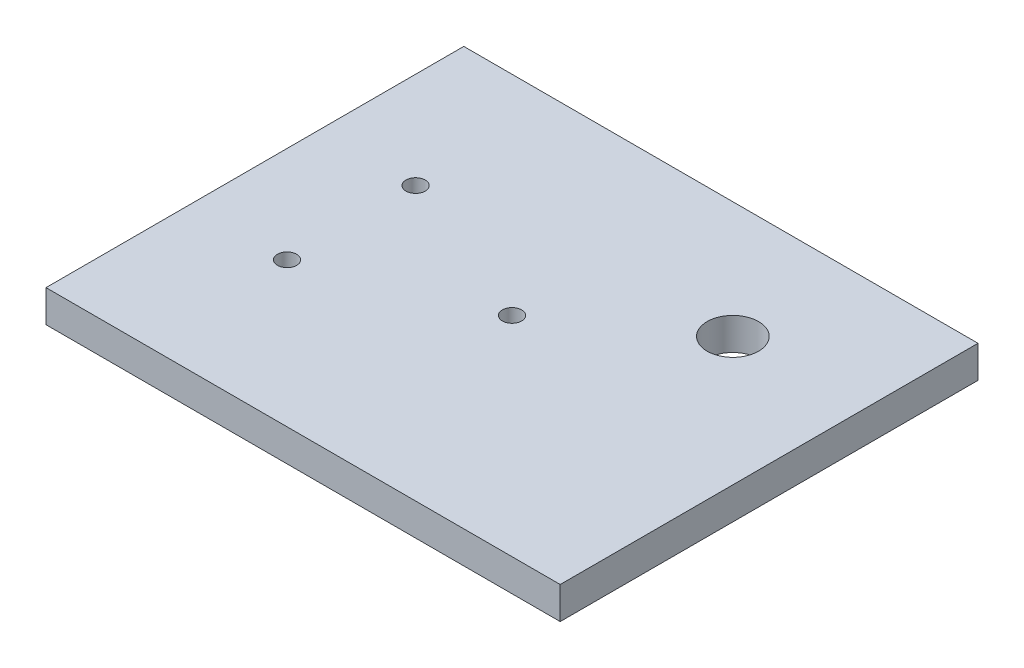
ISO-10303-21;
HEADER;
FILE_DESCRIPTION(('STEP AP214'),'2;1');
FILE_NAME('part.step','',(''),(''),'','','');
FILE_SCHEMA(('AUTOMOTIVE_DESIGN { 1 0 10303 214 1 1 1 1 }'));
ENDSEC;
DATA;
#1=APPLICATION_CONTEXT('core data for automotive mechanical design processes');
#2=APPLICATION_PROTOCOL_DEFINITION('international standard','automotive_design',2000,#1);
#3=PRODUCT_CONTEXT('',#1,'mechanical');
#4=PRODUCT('Part','Part','',(#3));
#5=PRODUCT_RELATED_PRODUCT_CATEGORY('part','',(#4));
#6=PRODUCT_DEFINITION_FORMATION('','',#4);
#7=PRODUCT_DEFINITION_CONTEXT('part definition',#1,'design');
#8=PRODUCT_DEFINITION('design','',#6,#7);
#9=PRODUCT_DEFINITION_SHAPE('','',#8);
#10=(LENGTH_UNIT() NAMED_UNIT(*) SI_UNIT(.MILLI.,.METRE.));
#11=(NAMED_UNIT(*) PLANE_ANGLE_UNIT() SI_UNIT($,.RADIAN.));
#12=(NAMED_UNIT(*) SI_UNIT($,.STERADIAN.) SOLID_ANGLE_UNIT());
#13=UNCERTAINTY_MEASURE_WITH_UNIT(LENGTH_MEASURE(1.E-05),#10,'distance_accuracy_value','');
#14=(GEOMETRIC_REPRESENTATION_CONTEXT(3) GLOBAL_UNCERTAINTY_ASSIGNED_CONTEXT((#13)) GLOBAL_UNIT_ASSIGNED_CONTEXT((#10,
#11,#12)) REPRESENTATION_CONTEXT('',''));
#15=CARTESIAN_POINT('',(0.,0.,0.));
#16=DIRECTION('',(0.,0.,1.));
#17=DIRECTION('',(1.,0.,0.));
#18=AXIS2_PLACEMENT_3D('',#15,#16,#17);
#19=CARTESIAN_POINT('',(0.,5.,0.));
#20=DIRECTION('',(0.,-1.,0.));
#21=DIRECTION('',(0.,0.,-1.));
#22=AXIS2_PLACEMENT_3D('',#19,#20,#21);
#23=PLANE('',#22);
#24=DIRECTION('',(0.,0.,-1.));
#25=VECTOR('',#24,1.);
#26=CARTESIAN_POINT('',(41.3967093056756,5.,32.6160751944685));
#27=LINE('',#26,#25);
#28=CARTESIAN_POINT('',(41.3967093056756,5.,32.6160751944685));
#29=VERTEX_POINT('',#28);
#30=CARTESIAN_POINT('',(41.3967093056756,5.,-32.3839248055315));
#31=VERTEX_POINT('',#30);
#32=EDGE_CURVE('E96',#29,#31,#27,.T.);
#33=ORIENTED_EDGE('',*,*,#32,.T.);
#34=DIRECTION('',(-1.,0.,0.));
#35=VECTOR('',#34,1.);
#36=CARTESIAN_POINT('',(-38.6032906943244,5.,-32.3839248055315));
#37=LINE('',#36,#35);
#38=CARTESIAN_POINT('',(-38.6032906943244,5.,-32.3839248055315));
#39=VERTEX_POINT('',#38);
#40=EDGE_CURVE('E91',#31,#39,#37,.T.);
#41=ORIENTED_EDGE('',*,*,#40,.T.);
#42=DIRECTION('',(0.,0.,1.));
#43=VECTOR('',#42,1.);
#44=CARTESIAN_POINT('',(-38.6032906943244,5.,32.6160751944685));
#45=LINE('',#44,#43);
#46=CARTESIAN_POINT('',(-38.6032906943244,5.,32.6160751944685));
#47=VERTEX_POINT('',#46);
#48=EDGE_CURVE('E94',#39,#47,#45,.T.);
#49=ORIENTED_EDGE('',*,*,#48,.T.);
#50=DIRECTION('',(1.,0.,0.));
#51=VECTOR('',#50,1.);
#52=CARTESIAN_POINT('',(-38.6032906943244,5.,32.6160751944685));
#53=LINE('',#52,#51);
#54=EDGE_CURVE('E61',#47,#29,#53,.T.);
#55=ORIENTED_EDGE('',*,*,#54,.T.);
#56=EDGE_LOOP('',(#33,#41,#49,#55));
#57=FACE_BOUND('',#56,.T.);
#58=CARTESIAN_POINT('',(21.3967093056756,5.,-14.2449484536082));
#59=DIRECTION('',(0.,1.,0.));
#60=DIRECTION('',(0.,0.,1.));
#61=AXIS2_PLACEMENT_3D('',#58,#59,#60);
#62=CIRCLE('',#61,4.00000000000001);
#63=CARTESIAN_POINT('',(21.3967093056756,5.,-10.2449484536082));
#64=VERTEX_POINT('',#63);
#65=EDGE_CURVE('E116',#64,#64,#62,.T.);
#66=ORIENTED_EDGE('',*,*,#65,.F.);
#67=EDGE_LOOP('',(#66));
#68=FACE_BOUND('',#67,.T.);
#69=CARTESIAN_POINT('',(1.39670930567559,5.,0.116075194468497));
#70=DIRECTION('',(0.,1.,0.));
#71=DIRECTION('',(0.,0.,1.));
#72=AXIS2_PLACEMENT_3D('',#69,#70,#71);
#73=CIRCLE('',#72,1.5);
#74=CARTESIAN_POINT('',(1.39670930567559,5.,1.6160751944685));
#75=VERTEX_POINT('',#74);
#76=EDGE_CURVE('E138',#75,#75,#73,.T.);
#77=ORIENTED_EDGE('',*,*,#76,.F.);
#78=EDGE_LOOP('',(#77));
#79=FACE_BOUND('',#78,.T.);
#80=CARTESIAN_POINT('',(-23.6032906943244,5.,-9.8839248055315));
#81=DIRECTION('',(0.,1.,0.));
#82=DIRECTION('',(0.,0.,1.));
#83=AXIS2_PLACEMENT_3D('',#80,#81,#82);
#84=CIRCLE('',#83,1.5);
#85=CARTESIAN_POINT('',(-23.6032906943244,5.,-8.38392480553151));
#86=VERTEX_POINT('',#85);
#87=EDGE_CURVE('E146',#86,#86,#84,.T.);
#88=ORIENTED_EDGE('',*,*,#87,.F.);
#89=EDGE_LOOP('',(#88));
#90=FACE_BOUND('',#89,.T.);
#91=CARTESIAN_POINT('',(-23.6032906943244,5.,10.1160751944685));
#92=DIRECTION('',(0.,1.,0.));
#93=DIRECTION('',(0.,0.,-1.));
#94=AXIS2_PLACEMENT_3D('',#91,#92,#93);
#95=CIRCLE('',#94,1.5);
#96=CARTESIAN_POINT('',(-23.6032906943244,5.,8.6160751944685));
#97=VERTEX_POINT('',#96);
#98=EDGE_CURVE('E154',#97,#97,#95,.T.);
#99=ORIENTED_EDGE('',*,*,#98,.F.);
#100=EDGE_LOOP('',(#99));
#101=FACE_BOUND('',#100,.T.);
#102=ADVANCED_FACE('F43',(#57,#68,#79,#90,#101),#23,.F.);
#103=CARTESIAN_POINT('',(0.,0.,0.));
#104=DIRECTION('',(0.,-1.,0.));
#105=DIRECTION('',(0.,0.,-1.));
#106=AXIS2_PLACEMENT_3D('',#103,#104,#105);
#107=PLANE('',#106);
#108=CARTESIAN_POINT('',(-23.6032906943244,0.,-9.8839248055315));
#109=DIRECTION('',(0.,1.,0.));
#110=DIRECTION('',(0.,0.,1.));
#111=AXIS2_PLACEMENT_3D('',#108,#109,#110);
#112=CIRCLE('',#111,1.5);
#113=CARTESIAN_POINT('',(-23.6032906943244,0.,-8.38392480553151));
#114=VERTEX_POINT('',#113);
#115=EDGE_CURVE('E150',#114,#114,#112,.T.);
#116=ORIENTED_EDGE('',*,*,#115,.T.);
#117=EDGE_LOOP('',(#116));
#118=FACE_BOUND('',#117,.T.);
#119=CARTESIAN_POINT('',(21.3967093056756,0.,-14.2449484536082));
#120=DIRECTION('',(0.,1.,0.));
#121=DIRECTION('',(0.,0.,1.));
#122=AXIS2_PLACEMENT_3D('',#119,#120,#121);
#123=CIRCLE('',#122,4.00000000000001);
#124=CARTESIAN_POINT('',(21.3967093056756,0.,-10.2449484536082));
#125=VERTEX_POINT('',#124);
#126=EDGE_CURVE('E134',#125,#125,#123,.T.);
#127=ORIENTED_EDGE('',*,*,#126,.T.);
#128=EDGE_LOOP('',(#127));
#129=FACE_BOUND('',#128,.T.);
#130=DIRECTION('',(0.,0.,-1.));
#131=VECTOR('',#130,1.);
#132=CARTESIAN_POINT('',(41.3967093056756,0.,32.6160751944685));
#133=LINE('',#132,#131);
#134=CARTESIAN_POINT('',(41.3967093056756,0.,32.6160751944685));
#135=VERTEX_POINT('',#134);
#136=CARTESIAN_POINT('',(41.3967093056756,0.,-32.3839248055315));
#137=VERTEX_POINT('',#136);
#138=EDGE_CURVE('E112',#135,#137,#133,.T.);
#139=ORIENTED_EDGE('',*,*,#138,.F.);
#140=DIRECTION('',(1.,0.,0.));
#141=VECTOR('',#140,1.);
#142=CARTESIAN_POINT('',(-38.6032906943244,0.,32.6160751944685));
#143=LINE('',#142,#141);
#144=CARTESIAN_POINT('',(-38.6032906943244,0.,32.6160751944685));
#145=VERTEX_POINT('',#144);
#146=EDGE_CURVE('E84',#145,#135,#143,.T.);
#147=ORIENTED_EDGE('',*,*,#146,.F.);
#148=DIRECTION('',(0.,0.,1.));
#149=VECTOR('',#148,1.);
#150=CARTESIAN_POINT('',(-38.6032906943244,0.,32.6160751944685));
#151=LINE('',#150,#149);
#152=CARTESIAN_POINT('',(-38.6032906943244,0.,-32.3839248055315));
#153=VERTEX_POINT('',#152);
#154=EDGE_CURVE('E78',#153,#145,#151,.T.);
#155=ORIENTED_EDGE('',*,*,#154,.F.);
#156=DIRECTION('',(-1.,0.,0.));
#157=VECTOR('',#156,1.);
#158=CARTESIAN_POINT('',(-38.6032906943244,0.,-32.3839248055315));
#159=LINE('',#158,#157);
#160=EDGE_CURVE('E101',#137,#153,#159,.T.);
#161=ORIENTED_EDGE('',*,*,#160,.F.);
#162=EDGE_LOOP('',(#139,#147,#155,#161));
#163=FACE_BOUND('',#162,.T.);
#164=CARTESIAN_POINT('',(1.39670930567559,0.,0.116075194468497));
#165=DIRECTION('',(0.,1.,0.));
#166=DIRECTION('',(0.,0.,1.));
#167=AXIS2_PLACEMENT_3D('',#164,#165,#166);
#168=CIRCLE('',#167,1.5);
#169=CARTESIAN_POINT('',(1.39670930567559,0.,1.6160751944685));
#170=VERTEX_POINT('',#169);
#171=EDGE_CURVE('E142',#170,#170,#168,.T.);
#172=ORIENTED_EDGE('',*,*,#171,.T.);
#173=EDGE_LOOP('',(#172));
#174=FACE_BOUND('',#173,.T.);
#175=CARTESIAN_POINT('',(-23.6032906943244,0.,10.1160751944685));
#176=DIRECTION('',(0.,1.,0.));
#177=DIRECTION('',(0.,0.,-1.));
#178=AXIS2_PLACEMENT_3D('',#175,#176,#177);
#179=CIRCLE('',#178,1.5);
#180=CARTESIAN_POINT('',(-23.6032906943244,0.,8.6160751944685));
#181=VERTEX_POINT('',#180);
#182=EDGE_CURVE('E158',#181,#181,#179,.T.);
#183=ORIENTED_EDGE('',*,*,#182,.T.);
#184=EDGE_LOOP('',(#183));
#185=FACE_BOUND('',#184,.T.);
#186=ADVANCED_FACE('F129',(#118,#129,#163,#174,#185),#107,.T.);
#187=CARTESIAN_POINT('',(41.3967093056756,5.,32.6160751944685));
#188=DIRECTION('',(-1.,0.,0.));
#189=DIRECTION('',(0.,0.,1.));
#190=AXIS2_PLACEMENT_3D('',#187,#188,#189);
#191=PLANE('',#190);
#192=ORIENTED_EDGE('',*,*,#138,.T.);
#193=DIRECTION('',(0.,-1.,0.));
#194=VECTOR('',#193,1.);
#195=CARTESIAN_POINT('',(41.3967093056756,5.,-32.3839248055315));
#196=LINE('',#195,#194);
#197=EDGE_CURVE('E11',#31,#137,#196,.T.);
#198=ORIENTED_EDGE('',*,*,#197,.F.);
#199=ORIENTED_EDGE('',*,*,#32,.F.);
#200=DIRECTION('',(0.,-1.,0.));
#201=VECTOR('',#200,1.);
#202=CARTESIAN_POINT('',(41.3967093056756,5.,32.6160751944685));
#203=LINE('',#202,#201);
#204=EDGE_CURVE('E108',#29,#135,#203,.T.);
#205=ORIENTED_EDGE('',*,*,#204,.T.);
#206=EDGE_LOOP('',(#192,#198,#199,#205));
#207=FACE_BOUND('',#206,.T.);
#208=ADVANCED_FACE('F45',(#207),#191,.F.);
#209=CARTESIAN_POINT('',(-38.6032906943244,5.,-32.3839248055315));
#210=DIRECTION('',(0.,0.,1.));
#211=DIRECTION('',(1.,0.,0.));
#212=AXIS2_PLACEMENT_3D('',#209,#210,#211);
#213=PLANE('',#212);
#214=ORIENTED_EDGE('',*,*,#160,.T.);
#215=DIRECTION('',(0.,-1.,0.));
#216=VECTOR('',#215,1.);
#217=CARTESIAN_POINT('',(-38.6032906943244,5.,-32.3839248055315));
#218=LINE('',#217,#216);
#219=EDGE_CURVE('E53',#39,#153,#218,.T.);
#220=ORIENTED_EDGE('',*,*,#219,.F.);
#221=ORIENTED_EDGE('',*,*,#40,.F.);
#222=ORIENTED_EDGE('',*,*,#197,.T.);
#223=EDGE_LOOP('',(#214,#220,#221,#222));
#224=FACE_BOUND('',#223,.T.);
#225=ADVANCED_FACE('F100',(#224),#213,.F.);
#226=CARTESIAN_POINT('',(-38.6032906943244,5.,32.6160751944685));
#227=DIRECTION('',(1.,0.,0.));
#228=DIRECTION('',(0.,0.,-1.));
#229=AXIS2_PLACEMENT_3D('',#226,#227,#228);
#230=PLANE('',#229);
#231=ORIENTED_EDGE('',*,*,#154,.T.);
#232=DIRECTION('',(0.,-1.,0.));
#233=VECTOR('',#232,1.);
#234=CARTESIAN_POINT('',(-38.6032906943244,5.,32.6160751944685));
#235=LINE('',#234,#233);
#236=EDGE_CURVE('E103',#47,#145,#235,.T.);
#237=ORIENTED_EDGE('',*,*,#236,.F.);
#238=ORIENTED_EDGE('',*,*,#48,.F.);
#239=ORIENTED_EDGE('',*,*,#219,.T.);
#240=EDGE_LOOP('',(#231,#237,#238,#239));
#241=FACE_BOUND('',#240,.T.);
#242=ADVANCED_FACE('F104',(#241),#230,.F.);
#243=CARTESIAN_POINT('',(-38.6032906943244,5.,32.6160751944685));
#244=DIRECTION('',(0.,0.,-1.));
#245=DIRECTION('',(-1.,0.,0.));
#246=AXIS2_PLACEMENT_3D('',#243,#244,#245);
#247=PLANE('',#246);
#248=ORIENTED_EDGE('',*,*,#146,.T.);
#249=ORIENTED_EDGE('',*,*,#204,.F.);
#250=ORIENTED_EDGE('',*,*,#54,.F.);
#251=ORIENTED_EDGE('',*,*,#236,.T.);
#252=EDGE_LOOP('',(#248,#249,#250,#251));
#253=FACE_BOUND('',#252,.T.);
#254=ADVANCED_FACE('F126',(#253),#247,.F.);
#255=CARTESIAN_POINT('',(21.3967093056756,5.,-14.2449484536082));
#256=DIRECTION('',(0.,-1.,0.));
#257=DIRECTION('',(0.,0.,-1.));
#258=AXIS2_PLACEMENT_3D('',#255,#256,#257);
#259=CYLINDRICAL_SURFACE('',#258,4.00000000000001);
#260=ORIENTED_EDGE('',*,*,#65,.T.);
#261=EDGE_LOOP('',(#260));
#262=FACE_BOUND('',#261,.T.);
#263=ORIENTED_EDGE('',*,*,#126,.F.);
#264=EDGE_LOOP('',(#263));
#265=FACE_BOUND('',#264,.T.);
#266=ADVANCED_FACE('F177',(#262,#265),#259,.F.);
#267=CARTESIAN_POINT('',(1.39670930567559,5.,0.116075194468497));
#268=DIRECTION('',(0.,-1.,0.));
#269=DIRECTION('',(0.,0.,-1.));
#270=AXIS2_PLACEMENT_3D('',#267,#268,#269);
#271=CYLINDRICAL_SURFACE('',#270,1.5);
#272=ORIENTED_EDGE('',*,*,#76,.T.);
#273=EDGE_LOOP('',(#272));
#274=FACE_BOUND('',#273,.T.);
#275=ORIENTED_EDGE('',*,*,#171,.F.);
#276=EDGE_LOOP('',(#275));
#277=FACE_BOUND('',#276,.T.);
#278=ADVANCED_FACE('F231',(#274,#277),#271,.F.);
#279=CARTESIAN_POINT('',(-23.6032906943244,5.,-9.8839248055315));
#280=DIRECTION('',(0.,-1.,0.));
#281=DIRECTION('',(0.,0.,-1.));
#282=AXIS2_PLACEMENT_3D('',#279,#280,#281);
#283=CYLINDRICAL_SURFACE('',#282,1.5);
#284=ORIENTED_EDGE('',*,*,#87,.T.);
#285=EDGE_LOOP('',(#284));
#286=FACE_BOUND('',#285,.T.);
#287=ORIENTED_EDGE('',*,*,#115,.F.);
#288=EDGE_LOOP('',(#287));
#289=FACE_BOUND('',#288,.T.);
#290=ADVANCED_FACE('F240',(#286,#289),#283,.F.);
#291=CARTESIAN_POINT('',(-23.6032906943244,5.,10.1160751944685));
#292=DIRECTION('',(0.,-1.,0.));
#293=DIRECTION('',(0.,0.,-1.));
#294=AXIS2_PLACEMENT_3D('',#291,#292,#293);
#295=CYLINDRICAL_SURFACE('',#294,1.5);
#296=ORIENTED_EDGE('',*,*,#98,.T.);
#297=EDGE_LOOP('',(#296));
#298=FACE_BOUND('',#297,.T.);
#299=ORIENTED_EDGE('',*,*,#182,.F.);
#300=EDGE_LOOP('',(#299));
#301=FACE_BOUND('',#300,.T.);
#302=ADVANCED_FACE('F166',(#298,#301),#295,.F.);
#303=CLOSED_SHELL('',(#102,#186,#208,#225,#242,#254,#266,#278,#290,#302));
#304=MANIFOLD_SOLID_BREP('B2',#303);
#305=ADVANCED_BREP_SHAPE_REPRESENTATION('',(#18,#304),#14);
#306=SHAPE_DEFINITION_REPRESENTATION(#9,#305);
ENDSEC;
END-ISO-10303-21;
